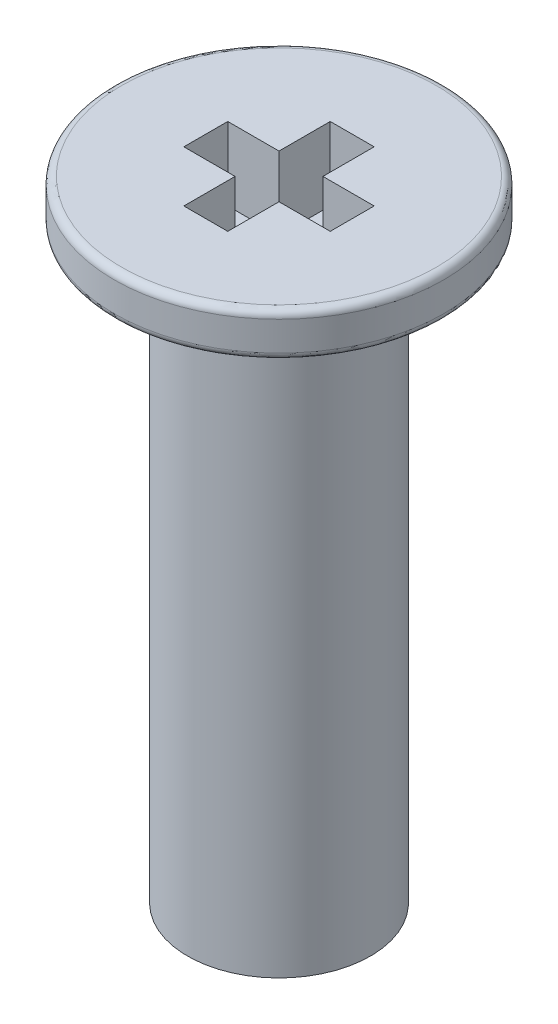
ISO-10303-21;
HEADER;
FILE_DESCRIPTION(('STEP AP214'),'2;1');
FILE_NAME('part.step','',(''),(''),'','','');
FILE_SCHEMA(('AUTOMOTIVE_DESIGN { 1 0 10303 214 1 1 1 1 }'));
ENDSEC;
DATA;
#1=APPLICATION_CONTEXT('core data for automotive mechanical design processes');
#2=APPLICATION_PROTOCOL_DEFINITION('international standard','automotive_design',2000,#1);
#3=PRODUCT_CONTEXT('',#1,'mechanical');
#4=PRODUCT('Part','Part','',(#3));
#5=PRODUCT_RELATED_PRODUCT_CATEGORY('part','',(#4));
#6=PRODUCT_DEFINITION_FORMATION('','',#4);
#7=PRODUCT_DEFINITION_CONTEXT('part definition',#1,'design');
#8=PRODUCT_DEFINITION('design','',#6,#7);
#9=PRODUCT_DEFINITION_SHAPE('','',#8);
#10=(LENGTH_UNIT() NAMED_UNIT(*) SI_UNIT(.MILLI.,.METRE.));
#11=(NAMED_UNIT(*) PLANE_ANGLE_UNIT() SI_UNIT($,.RADIAN.));
#12=(NAMED_UNIT(*) SI_UNIT($,.STERADIAN.) SOLID_ANGLE_UNIT());
#13=UNCERTAINTY_MEASURE_WITH_UNIT(LENGTH_MEASURE(1.E-05),#10,'distance_accuracy_value','');
#14=(GEOMETRIC_REPRESENTATION_CONTEXT(3) GLOBAL_UNCERTAINTY_ASSIGNED_CONTEXT((#13)) GLOBAL_UNIT_ASSIGNED_CONTEXT((#10,
#11,#12)) REPRESENTATION_CONTEXT('',''));
#15=CARTESIAN_POINT('',(0.,0.,0.));
#16=DIRECTION('',(0.,0.,1.));
#17=DIRECTION('',(1.,0.,0.));
#18=AXIS2_PLACEMENT_3D('',#15,#16,#17);
#19=CARTESIAN_POINT('',(0.,7.6,0.));
#20=DIRECTION('',(0.,1.,0.));
#21=DIRECTION('',(0.,0.,1.));
#22=AXIS2_PLACEMENT_3D('',#19,#20,#21);
#23=PLANE('',#22);
#24=DIRECTION('',(-1.,0.,0.));
#25=VECTOR('',#24,1.);
#26=CARTESIAN_POINT('',(0.3,7.6,-1.));
#27=LINE('',#26,#25);
#28=CARTESIAN_POINT('',(0.3,7.6,-1.));
#29=VERTEX_POINT('',#28);
#30=CARTESIAN_POINT('',(-0.3,7.6,-1.));
#31=VERTEX_POINT('',#30);
#32=EDGE_CURVE('E122',#29,#31,#27,.T.);
#33=ORIENTED_EDGE('',*,*,#32,.T.);
#34=DIRECTION('',(0.,0.,1.));
#35=VECTOR('',#34,1.);
#36=CARTESIAN_POINT('',(-0.3,7.6,-1.));
#37=LINE('',#36,#35);
#38=CARTESIAN_POINT('',(-0.3,7.6,-0.3));
#39=VERTEX_POINT('',#38);
#40=EDGE_CURVE('E119',#31,#39,#37,.T.);
#41=ORIENTED_EDGE('',*,*,#40,.T.);
#42=DIRECTION('',(-1.,0.,0.));
#43=VECTOR('',#42,1.);
#44=CARTESIAN_POINT('',(-0.3,7.6,-0.3));
#45=LINE('',#44,#43);
#46=CARTESIAN_POINT('',(-1.,7.6,-0.3));
#47=VERTEX_POINT('',#46);
#48=EDGE_CURVE('E116',#39,#47,#45,.T.);
#49=ORIENTED_EDGE('',*,*,#48,.T.);
#50=DIRECTION('',(0.,0.,1.));
#51=VECTOR('',#50,1.);
#52=CARTESIAN_POINT('',(-1.,7.6,-0.3));
#53=LINE('',#52,#51);
#54=CARTESIAN_POINT('',(-1.,7.6,0.3));
#55=VERTEX_POINT('',#54);
#56=EDGE_CURVE('E139',#47,#55,#53,.T.);
#57=ORIENTED_EDGE('',*,*,#56,.T.);
#58=DIRECTION('',(1.,0.,0.));
#59=VECTOR('',#58,1.);
#60=CARTESIAN_POINT('',(-1.,7.6,0.3));
#61=LINE('',#60,#59);
#62=CARTESIAN_POINT('',(-0.3,7.6,0.3));
#63=VERTEX_POINT('',#62);
#64=EDGE_CURVE('E249',#55,#63,#61,.T.);
#65=ORIENTED_EDGE('',*,*,#64,.T.);
#66=DIRECTION('',(0.,0.,1.));
#67=VECTOR('',#66,1.);
#68=CARTESIAN_POINT('',(-0.3,7.6,0.3));
#69=LINE('',#68,#67);
#70=CARTESIAN_POINT('',(-0.3,7.6,1.));
#71=VERTEX_POINT('',#70);
#72=EDGE_CURVE('E244',#63,#71,#69,.T.);
#73=ORIENTED_EDGE('',*,*,#72,.T.);
#74=DIRECTION('',(1.,0.,0.));
#75=VECTOR('',#74,1.);
#76=CARTESIAN_POINT('',(-0.3,7.6,1.));
#77=LINE('',#76,#75);
#78=CARTESIAN_POINT('',(0.3,7.6,1.));
#79=VERTEX_POINT('',#78);
#80=EDGE_CURVE('E239',#71,#79,#77,.T.);
#81=ORIENTED_EDGE('',*,*,#80,.T.);
#82=DIRECTION('',(0.,0.,-1.));
#83=VECTOR('',#82,1.);
#84=CARTESIAN_POINT('',(0.3,7.6,1.));
#85=LINE('',#84,#83);
#86=CARTESIAN_POINT('',(0.3,7.6,0.3));
#87=VERTEX_POINT('',#86);
#88=EDGE_CURVE('E234',#79,#87,#85,.T.);
#89=ORIENTED_EDGE('',*,*,#88,.T.);
#90=DIRECTION('',(1.,0.,0.));
#91=VECTOR('',#90,1.);
#92=CARTESIAN_POINT('',(0.3,7.6,0.3));
#93=LINE('',#92,#91);
#94=CARTESIAN_POINT('',(1.,7.6,0.3));
#95=VERTEX_POINT('',#94);
#96=EDGE_CURVE('E229',#87,#95,#93,.T.);
#97=ORIENTED_EDGE('',*,*,#96,.T.);
#98=DIRECTION('',(0.,0.,-1.));
#99=VECTOR('',#98,1.);
#100=CARTESIAN_POINT('',(1.,7.6,0.3));
#101=LINE('',#100,#99);
#102=CARTESIAN_POINT('',(1.,7.6,-0.3));
#103=VERTEX_POINT('',#102);
#104=EDGE_CURVE('E224',#95,#103,#101,.T.);
#105=ORIENTED_EDGE('',*,*,#104,.T.);
#106=DIRECTION('',(-1.,0.,0.));
#107=VECTOR('',#106,1.);
#108=CARTESIAN_POINT('',(1.,7.6,-0.3));
#109=LINE('',#108,#107);
#110=CARTESIAN_POINT('',(0.3,7.6,-0.3));
#111=VERTEX_POINT('',#110);
#112=EDGE_CURVE('E219',#103,#111,#109,.T.);
#113=ORIENTED_EDGE('',*,*,#112,.T.);
#114=DIRECTION('',(0.,0.,-1.));
#115=VECTOR('',#114,1.);
#116=CARTESIAN_POINT('',(0.3,7.6,-0.3));
#117=LINE('',#116,#115);
#118=EDGE_CURVE('E214',#111,#29,#117,.T.);
#119=ORIENTED_EDGE('',*,*,#118,.T.);
#120=EDGE_LOOP('',(#33,#41,#49,#57,#65,#73,#81,#89,#97,#105,#113,#119));
#121=FACE_BOUND('',#120,.T.);
#122=ADVANCED_FACE('F16',(#121),#23,.T.);
#123=CARTESIAN_POINT('',(-0.3,8.6,-1.));
#124=DIRECTION('',(-1.,0.,0.));
#125=DIRECTION('',(0.,0.,1.));
#126=AXIS2_PLACEMENT_3D('',#123,#124,#125);
#127=PLANE('',#126);
#128=ORIENTED_EDGE('',*,*,#40,.F.);
#129=DIRECTION('',(0.,1.,0.));
#130=VECTOR('',#129,1.);
#131=CARTESIAN_POINT('',(-0.3,8.6,-1.));
#132=LINE('',#131,#130);
#133=CARTESIAN_POINT('',(-0.3,8.6,-1.));
#134=VERTEX_POINT('',#133);
#135=EDGE_CURVE('E203',#31,#134,#132,.T.);
#136=ORIENTED_EDGE('',*,*,#135,.T.);
#137=DIRECTION('',(0.,0.,-1.));
#138=VECTOR('',#137,1.);
#139=CARTESIAN_POINT('',(-0.3,8.6,0.));
#140=LINE('',#139,#138);
#141=CARTESIAN_POINT('',(-0.3,8.6,-0.3));
#142=VERTEX_POINT('',#141);
#143=EDGE_CURVE('E130',#134,#142,#140,.F.);
#144=ORIENTED_EDGE('',*,*,#143,.T.);
#145=DIRECTION('',(0.,1.,0.));
#146=VECTOR('',#145,1.);
#147=CARTESIAN_POINT('',(-0.3,8.6,-0.3));
#148=LINE('',#147,#146);
#149=EDGE_CURVE('E125',#142,#39,#148,.F.);
#150=ORIENTED_EDGE('',*,*,#149,.T.);
#151=EDGE_LOOP('',(#128,#136,#144,#150));
#152=FACE_BOUND('',#151,.T.);
#153=ADVANCED_FACE('F128',(#152),#127,.F.);
#154=CARTESIAN_POINT('',(-0.3,8.6,-0.3));
#155=DIRECTION('',(0.,0.,-1.));
#156=DIRECTION('',(-1.,0.,0.));
#157=AXIS2_PLACEMENT_3D('',#154,#155,#156);
#158=PLANE('',#157);
#159=ORIENTED_EDGE('',*,*,#48,.F.);
#160=ORIENTED_EDGE('',*,*,#149,.F.);
#161=DIRECTION('',(1.,0.,0.));
#162=VECTOR('',#161,1.);
#163=CARTESIAN_POINT('',(0.,8.6,-0.3));
#164=LINE('',#163,#162);
#165=CARTESIAN_POINT('',(-1.,8.6,-0.3));
#166=VERTEX_POINT('',#165);
#167=EDGE_CURVE('E313',#142,#166,#164,.F.);
#168=ORIENTED_EDGE('',*,*,#167,.T.);
#169=DIRECTION('',(0.,1.,0.));
#170=VECTOR('',#169,1.);
#171=CARTESIAN_POINT('',(-1.,8.6,-0.3));
#172=LINE('',#171,#170);
#173=EDGE_CURVE('E136',#166,#47,#172,.F.);
#174=ORIENTED_EDGE('',*,*,#173,.T.);
#175=EDGE_LOOP('',(#159,#160,#168,#174));
#176=FACE_BOUND('',#175,.T.);
#177=ADVANCED_FACE('F134',(#176),#158,.F.);
#178=CARTESIAN_POINT('',(-1.,8.6,-0.3));
#179=DIRECTION('',(-1.,0.,0.));
#180=DIRECTION('',(0.,0.,1.));
#181=AXIS2_PLACEMENT_3D('',#178,#179,#180);
#182=PLANE('',#181);
#183=ORIENTED_EDGE('',*,*,#56,.F.);
#184=ORIENTED_EDGE('',*,*,#173,.F.);
#185=DIRECTION('',(0.,0.,-1.));
#186=VECTOR('',#185,1.);
#187=CARTESIAN_POINT('',(-1.,8.6,0.));
#188=LINE('',#187,#186);
#189=CARTESIAN_POINT('',(-1.,8.6,0.3));
#190=VERTEX_POINT('',#189);
#191=EDGE_CURVE('E258',#166,#190,#188,.F.);
#192=ORIENTED_EDGE('',*,*,#191,.T.);
#193=DIRECTION('',(0.,1.,0.));
#194=VECTOR('',#193,1.);
#195=CARTESIAN_POINT('',(-1.,8.6,0.3));
#196=LINE('',#195,#194);
#197=EDGE_CURVE('E251',#190,#55,#196,.F.);
#198=ORIENTED_EDGE('',*,*,#197,.T.);
#199=EDGE_LOOP('',(#183,#184,#192,#198));
#200=FACE_BOUND('',#199,.T.);
#201=ADVANCED_FACE('F256',(#200),#182,.F.);
#202=CARTESIAN_POINT('',(-1.,8.6,0.3));
#203=DIRECTION('',(0.,0.,1.));
#204=DIRECTION('',(1.,0.,0.));
#205=AXIS2_PLACEMENT_3D('',#202,#203,#204);
#206=PLANE('',#205);
#207=ORIENTED_EDGE('',*,*,#64,.F.);
#208=ORIENTED_EDGE('',*,*,#197,.F.);
#209=DIRECTION('',(1.,0.,0.));
#210=VECTOR('',#209,1.);
#211=CARTESIAN_POINT('',(0.,8.6,0.3));
#212=LINE('',#211,#210);
#213=CARTESIAN_POINT('',(-0.3,8.6,0.3));
#214=VERTEX_POINT('',#213);
#215=EDGE_CURVE('E264',#190,#214,#212,.T.);
#216=ORIENTED_EDGE('',*,*,#215,.T.);
#217=DIRECTION('',(0.,1.,0.));
#218=VECTOR('',#217,1.);
#219=CARTESIAN_POINT('',(-0.3,8.6,0.3));
#220=LINE('',#219,#218);
#221=EDGE_CURVE('E246',#214,#63,#220,.F.);
#222=ORIENTED_EDGE('',*,*,#221,.T.);
#223=EDGE_LOOP('',(#207,#208,#216,#222));
#224=FACE_BOUND('',#223,.T.);
#225=ADVANCED_FACE('F261',(#224),#206,.F.);
#226=CARTESIAN_POINT('',(-0.3,8.6,0.3));
#227=DIRECTION('',(-1.,0.,0.));
#228=DIRECTION('',(0.,0.,1.));
#229=AXIS2_PLACEMENT_3D('',#226,#227,#228);
#230=PLANE('',#229);
#231=ORIENTED_EDGE('',*,*,#72,.F.);
#232=ORIENTED_EDGE('',*,*,#221,.F.);
#233=DIRECTION('',(0.,0.,-1.));
#234=VECTOR('',#233,1.);
#235=CARTESIAN_POINT('',(-0.3,8.6,0.));
#236=LINE('',#235,#234);
#237=CARTESIAN_POINT('',(-0.3,8.6,1.));
#238=VERTEX_POINT('',#237);
#239=EDGE_CURVE('E318',#214,#238,#236,.F.);
#240=ORIENTED_EDGE('',*,*,#239,.T.);
#241=DIRECTION('',(0.,1.,0.));
#242=VECTOR('',#241,1.);
#243=CARTESIAN_POINT('',(-0.3,8.6,1.));
#244=LINE('',#243,#242);
#245=EDGE_CURVE('E241',#238,#71,#244,.F.);
#246=ORIENTED_EDGE('',*,*,#245,.T.);
#247=EDGE_LOOP('',(#231,#232,#240,#246));
#248=FACE_BOUND('',#247,.T.);
#249=ADVANCED_FACE('F267',(#248),#230,.F.);
#250=CARTESIAN_POINT('',(-0.3,8.6,1.));
#251=DIRECTION('',(0.,0.,1.));
#252=DIRECTION('',(1.,0.,0.));
#253=AXIS2_PLACEMENT_3D('',#250,#251,#252);
#254=PLANE('',#253);
#255=ORIENTED_EDGE('',*,*,#80,.F.);
#256=ORIENTED_EDGE('',*,*,#245,.F.);
#257=DIRECTION('',(1.,0.,0.));
#258=VECTOR('',#257,1.);
#259=CARTESIAN_POINT('',(0.,8.6,1.));
#260=LINE('',#259,#258);
#261=CARTESIAN_POINT('',(0.3,8.6,1.));
#262=VERTEX_POINT('',#261);
#263=EDGE_CURVE('E275',#238,#262,#260,.T.);
#264=ORIENTED_EDGE('',*,*,#263,.T.);
#265=DIRECTION('',(0.,1.,0.));
#266=VECTOR('',#265,1.);
#267=CARTESIAN_POINT('',(0.3,8.6,1.));
#268=LINE('',#267,#266);
#269=EDGE_CURVE('E236',#262,#79,#268,.F.);
#270=ORIENTED_EDGE('',*,*,#269,.T.);
#271=EDGE_LOOP('',(#255,#256,#264,#270));
#272=FACE_BOUND('',#271,.T.);
#273=ADVANCED_FACE('F273',(#272),#254,.F.);
#274=CARTESIAN_POINT('',(0.3,8.6,1.));
#275=DIRECTION('',(1.,0.,0.));
#276=DIRECTION('',(0.,0.,-1.));
#277=AXIS2_PLACEMENT_3D('',#274,#275,#276);
#278=PLANE('',#277);
#279=ORIENTED_EDGE('',*,*,#88,.F.);
#280=ORIENTED_EDGE('',*,*,#269,.F.);
#281=DIRECTION('',(0.,0.,-1.));
#282=VECTOR('',#281,1.);
#283=CARTESIAN_POINT('',(0.3,8.6,0.));
#284=LINE('',#283,#282);
#285=CARTESIAN_POINT('',(0.3,8.6,0.3));
#286=VERTEX_POINT('',#285);
#287=EDGE_CURVE('E281',#262,#286,#284,.T.);
#288=ORIENTED_EDGE('',*,*,#287,.T.);
#289=DIRECTION('',(0.,1.,0.));
#290=VECTOR('',#289,1.);
#291=CARTESIAN_POINT('',(0.3,8.6,0.3));
#292=LINE('',#291,#290);
#293=EDGE_CURVE('E231',#286,#87,#292,.F.);
#294=ORIENTED_EDGE('',*,*,#293,.T.);
#295=EDGE_LOOP('',(#279,#280,#288,#294));
#296=FACE_BOUND('',#295,.T.);
#297=ADVANCED_FACE('F278',(#296),#278,.F.);
#298=CARTESIAN_POINT('',(0.3,8.6,0.3));
#299=DIRECTION('',(0.,0.,1.));
#300=DIRECTION('',(1.,0.,0.));
#301=AXIS2_PLACEMENT_3D('',#298,#299,#300);
#302=PLANE('',#301);
#303=ORIENTED_EDGE('',*,*,#96,.F.);
#304=ORIENTED_EDGE('',*,*,#293,.F.);
#305=DIRECTION('',(1.,0.,0.));
#306=VECTOR('',#305,1.);
#307=CARTESIAN_POINT('',(0.,8.6,0.3));
#308=LINE('',#307,#306);
#309=CARTESIAN_POINT('',(1.,8.6,0.3));
#310=VERTEX_POINT('',#309);
#311=EDGE_CURVE('E322',#286,#310,#308,.T.);
#312=ORIENTED_EDGE('',*,*,#311,.T.);
#313=DIRECTION('',(0.,1.,0.));
#314=VECTOR('',#313,1.);
#315=CARTESIAN_POINT('',(1.,8.6,0.3));
#316=LINE('',#315,#314);
#317=EDGE_CURVE('E226',#310,#95,#316,.F.);
#318=ORIENTED_EDGE('',*,*,#317,.T.);
#319=EDGE_LOOP('',(#303,#304,#312,#318));
#320=FACE_BOUND('',#319,.T.);
#321=ADVANCED_FACE('F284',(#320),#302,.F.);
#322=CARTESIAN_POINT('',(1.,8.6,0.3));
#323=DIRECTION('',(1.,0.,0.));
#324=DIRECTION('',(0.,0.,-1.));
#325=AXIS2_PLACEMENT_3D('',#322,#323,#324);
#326=PLANE('',#325);
#327=ORIENTED_EDGE('',*,*,#104,.F.);
#328=ORIENTED_EDGE('',*,*,#317,.F.);
#329=DIRECTION('',(0.,0.,-1.));
#330=VECTOR('',#329,1.);
#331=CARTESIAN_POINT('',(1.,8.6,0.));
#332=LINE('',#331,#330);
#333=CARTESIAN_POINT('',(1.,8.6,-0.3));
#334=VERTEX_POINT('',#333);
#335=EDGE_CURVE('E292',#310,#334,#332,.T.);
#336=ORIENTED_EDGE('',*,*,#335,.T.);
#337=DIRECTION('',(0.,1.,0.));
#338=VECTOR('',#337,1.);
#339=CARTESIAN_POINT('',(1.,8.6,-0.3));
#340=LINE('',#339,#338);
#341=EDGE_CURVE('E221',#334,#103,#340,.F.);
#342=ORIENTED_EDGE('',*,*,#341,.T.);
#343=EDGE_LOOP('',(#327,#328,#336,#342));
#344=FACE_BOUND('',#343,.T.);
#345=ADVANCED_FACE('F290',(#344),#326,.F.);
#346=CARTESIAN_POINT('',(1.,8.6,-0.3));
#347=DIRECTION('',(0.,0.,-1.));
#348=DIRECTION('',(-1.,0.,0.));
#349=AXIS2_PLACEMENT_3D('',#346,#347,#348);
#350=PLANE('',#349);
#351=ORIENTED_EDGE('',*,*,#112,.F.);
#352=ORIENTED_EDGE('',*,*,#341,.F.);
#353=DIRECTION('',(1.,0.,0.));
#354=VECTOR('',#353,1.);
#355=CARTESIAN_POINT('',(0.,8.6,-0.3));
#356=LINE('',#355,#354);
#357=CARTESIAN_POINT('',(0.3,8.6,-0.3));
#358=VERTEX_POINT('',#357);
#359=EDGE_CURVE('E298',#334,#358,#356,.F.);
#360=ORIENTED_EDGE('',*,*,#359,.T.);
#361=DIRECTION('',(0.,1.,0.));
#362=VECTOR('',#361,1.);
#363=CARTESIAN_POINT('',(0.3,8.6,-0.3));
#364=LINE('',#363,#362);
#365=EDGE_CURVE('E216',#358,#111,#364,.F.);
#366=ORIENTED_EDGE('',*,*,#365,.T.);
#367=EDGE_LOOP('',(#351,#352,#360,#366));
#368=FACE_BOUND('',#367,.T.);
#369=ADVANCED_FACE('F295',(#368),#350,.F.);
#370=CARTESIAN_POINT('',(0.3,8.6,-0.3));
#371=DIRECTION('',(1.,0.,0.));
#372=DIRECTION('',(0.,0.,-1.));
#373=AXIS2_PLACEMENT_3D('',#370,#371,#372);
#374=PLANE('',#373);
#375=ORIENTED_EDGE('',*,*,#118,.F.);
#376=ORIENTED_EDGE('',*,*,#365,.F.);
#377=DIRECTION('',(0.,0.,-1.));
#378=VECTOR('',#377,1.);
#379=CARTESIAN_POINT('',(0.3,8.6,0.));
#380=LINE('',#379,#378);
#381=CARTESIAN_POINT('',(0.3,8.6,-1.));
#382=VERTEX_POINT('',#381);
#383=EDGE_CURVE('E303',#358,#382,#380,.T.);
#384=ORIENTED_EDGE('',*,*,#383,.T.);
#385=DIRECTION('',(0.,1.,0.));
#386=VECTOR('',#385,1.);
#387=CARTESIAN_POINT('',(0.3,8.6,-1.));
#388=LINE('',#387,#386);
#389=EDGE_CURVE('E211',#382,#29,#388,.F.);
#390=ORIENTED_EDGE('',*,*,#389,.T.);
#391=EDGE_LOOP('',(#375,#376,#384,#390));
#392=FACE_BOUND('',#391,.T.);
#393=ADVANCED_FACE('F301',(#392),#374,.F.);
#394=CARTESIAN_POINT('',(0.3,8.6,-1.));
#395=DIRECTION('',(0.,0.,-1.));
#396=DIRECTION('',(-1.,0.,0.));
#397=AXIS2_PLACEMENT_3D('',#394,#395,#396);
#398=PLANE('',#397);
#399=ORIENTED_EDGE('',*,*,#32,.F.);
#400=ORIENTED_EDGE('',*,*,#389,.F.);
#401=DIRECTION('',(1.,0.,0.));
#402=VECTOR('',#401,1.);
#403=CARTESIAN_POINT('',(0.,8.6,-1.));
#404=LINE('',#403,#402);
#405=EDGE_CURVE('E308',#382,#134,#404,.F.);
#406=ORIENTED_EDGE('',*,*,#405,.T.);
#407=ORIENTED_EDGE('',*,*,#135,.F.);
#408=EDGE_LOOP('',(#399,#400,#406,#407));
#409=FACE_BOUND('',#408,.T.);
#410=ADVANCED_FACE('F307',(#409),#398,.F.);
#411=CARTESIAN_POINT('',(0.,8.6,0.));
#412=DIRECTION('',(0.,-1.,0.));
#413=DIRECTION('',(0.,0.,-1.));
#414=AXIS2_PLACEMENT_3D('',#411,#412,#413);
#415=PLANE('',#414);
#416=ORIENTED_EDGE('',*,*,#383,.F.);
#417=ORIENTED_EDGE('',*,*,#359,.F.);
#418=ORIENTED_EDGE('',*,*,#335,.F.);
#419=ORIENTED_EDGE('',*,*,#311,.F.);
#420=ORIENTED_EDGE('',*,*,#287,.F.);
#421=ORIENTED_EDGE('',*,*,#263,.F.);
#422=ORIENTED_EDGE('',*,*,#239,.F.);
#423=ORIENTED_EDGE('',*,*,#215,.F.);
#424=ORIENTED_EDGE('',*,*,#191,.F.);
#425=ORIENTED_EDGE('',*,*,#167,.F.);
#426=ORIENTED_EDGE('',*,*,#143,.F.);
#427=ORIENTED_EDGE('',*,*,#405,.F.);
#428=EDGE_LOOP('',(#416,#417,#418,#419,#420,#421,#422,#423,#424,#425,#426,#427));
#429=FACE_BOUND('',#428,.T.);
#430=CARTESIAN_POINT('',(0.,8.6,0.));
#431=DIRECTION('',(0.,-1.,0.));
#432=DIRECTION('',(-1.,0.,0.));
#433=AXIS2_PLACEMENT_3D('',#430,#431,#432);
#434=CIRCLE('',#433,2.1499999932975);
#435=CARTESIAN_POINT('',(-2.149999989276,8.6,0.));
#436=VERTEX_POINT('',#435);
#437=CARTESIAN_POINT('',(2.149999989276,8.6,0.));
#438=VERTEX_POINT('',#437);
#439=EDGE_CURVE('E344',#436,#438,#434,.T.);
#440=ORIENTED_EDGE('',*,*,#439,.F.);
#441=CARTESIAN_POINT('',(2.149999986595,8.6,0.));
#442=CARTESIAN_POINT('',(2.15000080069782,8.60000000006606,0.00774593605143662));
#443=CARTESIAN_POINT('',(2.14996033296819,8.60000000003913,0.0154920532896195));
#444=CARTESIAN_POINT('',(2.14962310452812,8.59999999954828,0.0473801378276606));
#445=CARTESIAN_POINT('',(2.14896515022345,8.59999999828005,0.0715193011728395));
#446=CARTESIAN_POINT('',(2.14683394931852,8.59999999399274,0.11976118063808));
#447=CARTESIAN_POINT('',(2.14536069389768,8.59999999097364,0.143863896360994));
#448=CARTESIAN_POINT('',(2.14129184385814,8.59999998285581,0.195997430603873));
#449=CARTESIAN_POINT('',(2.13855067588309,8.59999997749528,0.224017025537864));
#450=CARTESIAN_POINT('',(2.13196958666373,8.59999996513263,0.279926932795387));
#451=CARTESIAN_POINT('',(2.12812965291208,8.5999999581305,0.307817243643594));
#452=CARTESIAN_POINT('',(2.11935718603045,8.59999994282781,0.363425880042789));
#453=CARTESIAN_POINT('',(2.11442464118614,8.59999993452725,0.391144203746554));
#454=CARTESIAN_POINT('',(2.10347447928715,8.59999991694442,0.446365957623545));
#455=CARTESIAN_POINT('',(2.09745685131675,8.59999990766214,0.473869385632056));
#456=CARTESIAN_POINT('',(2.08434581218323,8.59999988841404,0.528618897159319));
#457=CARTESIAN_POINT('',(2.07725239090954,8.59999987844819,0.555864978256907));
#458=CARTESIAN_POINT('',(2.06200069447204,8.5999998581104,0.610057708135593));
#459=CARTESIAN_POINT('',(2.05384241000484,8.59999984773845,0.637004354298386));
#460=CARTESIAN_POINT('',(2.03647356862558,8.59999982684575,0.690556597552216));
#461=CARTESIAN_POINT('',(2.02726300321614,8.59999981632501,0.717162191887262));
#462=CARTESIAN_POINT('',(2.00780380640816,8.59999979537179,0.769991238714149));
#463=CARTESIAN_POINT('',(1.99755516731364,8.59999978493931,0.796214688371225));
#464=CARTESIAN_POINT('',(1.97603563471533,8.59999976437943,0.848238943706191));
#465=CARTESIAN_POINT('',(1.96476473430895,8.59999975425204,0.874039746528859));
#466=CARTESIAN_POINT('',(1.94121807080314,8.59999973449889,0.925178858534139));
#467=CARTESIAN_POINT('',(1.92894230158318,8.59999972487315,0.950517164898597));
#468=CARTESIAN_POINT('',(1.9034048455692,8.59999970629963,1.00069214867668));
#469=CARTESIAN_POINT('',(1.89014315342213,8.59999969735185,1.02552882336578));
#470=CARTESIAN_POINT('',(1.86265432074884,8.59999968029037,1.07466218332238));
#471=CARTESIAN_POINT('',(1.84842717561924,8.59999967217666,1.09895886601442));
#472=CARTESIAN_POINT('',(1.81902939861524,8.59999965691913,1.1469747157121));
#473=CARTESIAN_POINT('',(1.80385876286618,8.59999964977532,1.17069388034549));
#474=CARTESIAN_POINT('',(1.77259742473602,8.59999963657318,1.21751805992205));
#475=CARTESIAN_POINT('',(1.75650671918496,8.59999963051486,1.24062307274885));
#476=CARTESIAN_POINT('',(1.7234300838262,8.59999961957906,1.28618326364882));
#477=CARTESIAN_POINT('',(1.70644415152619,8.59999961470158,1.30863843991257));
#478=CARTESIAN_POINT('',(1.67160328888854,8.59999960620256,1.35286427677269));
#479=CARTESIAN_POINT('',(1.65374835670632,8.59999960258103,1.37463493591592));
#480=CARTESIAN_POINT('',(1.61719706380519,8.59999959664878,1.41745811542631));
#481=CARTESIAN_POINT('',(1.59850070185671,8.59999959433806,1.43851063474399));
#482=CARTESIAN_POINT('',(1.56029541956434,8.59999959106205,1.47986502131745));
#483=CARTESIAN_POINT('',(1.54078649857048,8.59999959009676,1.50016688797275));
#484=CARTESIAN_POINT('',(1.5009862243135,8.59999958952599,1.53998861605828));
#485=CARTESIAN_POINT('',(1.48069487094199,8.59999958992051,1.55950847738018));
#486=CARTESIAN_POINT('',(1.43936106744049,8.59999959206348,1.59773605026213));
#487=CARTESIAN_POINT('',(1.41831861770323,8.59999959381193,1.61644376224683));
#488=CARTESIAN_POINT('',(1.37551511789299,8.59999959863666,1.65301814717662));
#489=CARTESIAN_POINT('',(1.35375406867106,8.59999960171293,1.67088482111771));
#490=CARTESIAN_POINT('',(1.30954697695609,8.59999960914696,1.70574954063073));
#491=CARTESIAN_POINT('',(1.28710093572741,8.5999996135047,1.7227475878058));
#492=CARTESIAN_POINT('',(1.2415585257159,8.59999962343505,1.7558488070819));
#493=CARTESIAN_POINT('',(1.21846215856364,8.59999962900766,1.77195198142634));
#494=CARTESIAN_POINT('',(1.17165476744577,8.5999996412809,1.80323859155864));
#495=CARTESIAN_POINT('',(1.14794374542793,8.59999964798153,1.81842203026052));
#496=CARTESIAN_POINT('',(1.09994366515913,8.59999966240373,1.84784572730363));
#497=CARTESIAN_POINT('',(1.07565460912235,8.59999967012529,1.86208598925693));
#498=CARTESIAN_POINT('',(1.02653597458109,8.59999968646203,1.88960134893141));
#499=CARTESIAN_POINT('',(1.00170639850478,8.59999969507719,1.90287645098717));
#500=CARTESIAN_POINT('',(0.951545072796554,8.59999971305355,1.92844099892718));
#501=CARTESIAN_POINT('',(0.926213325752882,8.59999972241473,1.94073044988992));
#502=CARTESIAN_POINT('',(0.875086782844244,8.59999974171532,1.96430472731528));
#503=CARTESIAN_POINT('',(0.849291989672395,8.59999975165471,1.97558955961857));
#504=CARTESIAN_POINT('',(0.797279194513991,8.59999977192365,1.99713718436665));
#505=CARTESIAN_POINT('',(0.771061195269073,8.59999978225318,2.00739998342935));
#506=CARTESIAN_POINT('',(0.718242481679461,8.59999980309408,2.02688770611376));
#507=CARTESIAN_POINT('',(0.691641770067589,8.59999981360544,2.0361126371424));
#508=CARTESIAN_POINT('',(0.638098716245726,8.59999983458146,2.05351039286826));
#509=CARTESIAN_POINT('',(0.611156376701597,8.59999984504611,2.06168322576987));
#510=CARTESIAN_POINT('',(0.556971679760432,8.59999986567986,2.07696417939713));
#511=CARTESIAN_POINT('',(0.529729324903508,8.59999987584896,2.08407230912977));
#512=CARTESIAN_POINT('',(0.474986670142488,8.59999989562273,2.09721290121152));
#513=CARTESIAN_POINT('',(0.447486372593535,8.5999999052274,2.10324537337187));
#514=CARTESIAN_POINT('',(0.392270314419468,8.59999992358243,2.11422533983751));
#515=CARTESIAN_POINT('',(0.364554555904893,8.59999993233279,2.11917284475674));
#516=CARTESIAN_POINT('',(0.308950348235704,8.59999994867188,2.12797531054694));
#517=CARTESIAN_POINT('',(0.281061900887815,8.59999995626062,2.13183028282868));
#518=CARTESIAN_POINT('',(0.225155509992018,8.59999996993841,2.13844155525239));
#519=CARTESIAN_POINT('',(0.19713756788577,8.59999997602748,2.14119786759602));
#520=CARTESIAN_POINT('',(0.139019984303278,8.59999998675506,2.14576510641112));
#521=CARTESIAN_POINT('',(0.108913937754954,8.59999999125969,2.14749490529091));
#522=CARTESIAN_POINT('',(0.0486559356796474,8.59999999759841,2.14968392118278));
#523=CARTESIAN_POINT('',(0.0185039807715552,8.59999999943254,2.15014315517419));
#524=CARTESIAN_POINT('',(-0.0367327257122932,8.60000000033861,2.14983009518945));
#525=CARTESIAN_POINT('',(-0.0618187933418984,8.5999999998224,2.14925151610049));
#526=CARTESIAN_POINT('',(-0.111950954808416,8.60000000013151,2.14723159840049));
#527=CARTESIAN_POINT('',(-0.136997056011809,8.60000000095655,2.14579044329457));
#528=CARTESIAN_POINT('',(-0.188934034654331,8.5999999893,2.14190230316815));
#529=CARTESIAN_POINT('',(-0.215819810990998,8.59999997579798,2.13938694465135));
#530=CARTESIAN_POINT('',(-0.269474540545667,8.59999990568424,2.13335947083679));
#531=CARTESIAN_POINT('',(-0.296243514808059,8.59999984908063,2.12984754331643));
#532=CARTESIAN_POINT('',(-0.341551986341568,8.59999964849556,2.12305072381684));
#533=CARTESIAN_POINT('',(-0.360129841535029,8.59999953614883,2.12001888138943));
#534=CARTESIAN_POINT('',(-0.395988099159118,8.59999928648878,2.1136780147832));
#535=CARTESIAN_POINT('',(-0.413273970144807,8.59999915128614,2.11040004095345));
#536=CARTESIAN_POINT('',(-0.447750179463647,8.59999894463088,2.10340388361942));
#537=CARTESIAN_POINT('',(-0.464940547681312,8.59999887315706,2.09968584701029));
#538=CARTESIAN_POINT('',(-0.508386298558855,8.59999878572617,2.08971115451948));
#539=CARTESIAN_POINT('',(-0.534574652583917,8.59999881987861,2.08315999208146));
#540=CARTESIAN_POINT('',(-0.586659017485568,8.5999990497247,2.06904120299429));
#541=CARTESIAN_POINT('',(-0.612555192380977,8.59999924532262,2.06147418089643));
#542=CARTESIAN_POINT('',(-0.654408942488655,8.59999957782712,2.04836685705507));
#543=CARTESIAN_POINT('',(-0.670461131331646,8.59999970932324,2.04312707189765));
#544=CARTESIAN_POINT('',(-0.702416444216825,8.59999991169169,2.03223251512861));
#545=CARTESIAN_POINT('',(-0.718319628225929,8.59999998258955,2.02657791932746));
#546=CARTESIAN_POINT('',(-0.74172684769567,8.60000000670886,2.01801787039137));
#547=CARTESIAN_POINT('',(-0.749271568504442,8.60000000209347,2.01522211386584));
#548=CARTESIAN_POINT('',(-0.778008200830705,8.59999999188275,2.0044058735253));
#549=CARTESIAN_POINT('',(-0.799100193739778,8.59999999973082,1.99611793752223));
#550=CARTESIAN_POINT('',(-0.853605230322323,8.59999998547424,1.97370161504216));
#551=CARTESIAN_POINT('',(-0.886807873296071,8.59999994254266,1.9590557492538));
#552=CARTESIAN_POINT('',(-0.933340836602631,8.59999982199671,1.93711651684663));
#553=CARTESIAN_POINT('',(-0.946995726462715,8.59999977908529,1.93050210824914));
#554=CARTESIAN_POINT('',(-0.975527727764956,8.59999966791427,1.91630837584245));
#555=CARTESIAN_POINT('',(-0.990389871635316,8.59999959754188,1.90869885724546));
#556=CARTESIAN_POINT('',(-1.02336933440679,8.59999942778698,1.89132210664677));
#557=CARTESIAN_POINT('',(-1.04143930348594,8.59999932546446,1.88146484536622));
#558=CARTESIAN_POINT('',(-1.07677089700574,8.59999914942806,1.86151572131735));
#559=CARTESIAN_POINT('',(-1.09404086584091,8.59999907498031,1.8514386088025));
#560=CARTESIAN_POINT('',(-1.1369790810182,8.59999893225028,1.82556179902836));
#561=CARTESIAN_POINT('',(-1.162462074814,8.59999888626602,1.80945301230116));
#562=CARTESIAN_POINT('',(-1.2115053106527,8.59999893721081,1.77695273050121));
#563=CARTESIAN_POINT('',(-1.23509916169675,8.59999902739387,1.76061181596461));
#564=CARTESIAN_POINT('',(-1.28657647332024,8.59999924674374,1.72339957685618));
#565=CARTESIAN_POINT('',(-1.31429976274231,8.59999938012287,1.70230609471656));
#566=CARTESIAN_POINT('',(-1.36698701757496,8.59999956741272,1.6601760384637));
#567=CARTESIAN_POINT('',(-1.3920148894351,8.59999962579173,1.63921923338516));
#568=CARTESIAN_POINT('',(-1.44043198069626,8.59999971565015,1.59677516773357));
#569=CARTESIAN_POINT('',(-1.46384721319268,8.59999974781452,1.57531759306845));
#570=CARTESIAN_POINT('',(-1.50798695252182,8.59999978604229,1.5330454864328));
#571=CARTESIAN_POINT('',(-1.52878139623543,8.59999979388637,1.51230391500476));
#572=CARTESIAN_POINT('',(-1.56785578122464,8.59999978765169,1.47171394645494));
#573=CARTESIAN_POINT('',(-1.58620271451367,8.59999977530323,1.45193000732491));
#574=CARTESIAN_POINT('',(-1.62055707330077,8.59999972698387,1.41347304403005));
#575=CARTESIAN_POINT('',(-1.63662787084996,8.59999969319961,1.39485659506107));
#576=CARTESIAN_POINT('',(-1.66549783522417,8.59999957522983,1.36025423494378));
#577=CARTESIAN_POINT('',(-1.67839440919856,8.59999950042574,1.34434951208863));
#578=CARTESIAN_POINT('',(-1.70044323676818,8.59999934222985,1.31635276608809));
#579=CARTESIAN_POINT('',(-1.70969887352107,8.59999926610082,1.30434208837876));
#580=CARTESIAN_POINT('',(-1.72804935744845,8.59999913736928,1.27998766953334));
#581=CARTESIAN_POINT('',(-1.73714125375118,8.59999908503907,1.26764170663138));
#582=CARTESIAN_POINT('',(-1.76291470311517,8.59999896787105,1.23183421047757));
#583=CARTESIAN_POINT('',(-1.77925494639789,8.59999893235638,1.20812575824767));
#584=CARTESIAN_POINT('',(-1.81127075638015,8.59999895917725,1.15957866498022));
#585=CARTESIAN_POINT('',(-1.8269264137164,8.59999902349,1.13472689264331));
#586=CARTESIAN_POINT('',(-1.85119125149652,8.59999917962963,1.0943711236435));
#587=CARTESIAN_POINT('',(-1.86013372984039,8.59999925044564,1.07906651937784));
#588=CARTESIAN_POINT('',(-1.87773098584277,8.59999940881095,1.0480596894104));
#589=CARTESIAN_POINT('',(-1.88638128196694,8.59999949654302,1.03235491599591));
#590=CARTESIAN_POINT('',(-1.90156868506059,8.5999996383761,1.00394265290586));
#591=CARTESIAN_POINT('',(-1.90817831609692,8.59999969568888,0.991273852247844));
#592=CARTESIAN_POINT('',(-1.92089355066472,8.59999978740271,0.966306198780744));
#593=CARTESIAN_POINT('',(-1.92700875726369,8.59999982261131,0.954012226457803));
#594=CARTESIAN_POINT('',(-1.946749368174,8.59999991756306,0.913362952353609));
#595=CARTESIAN_POINT('',(-1.95987759731027,8.5999999502929,0.884764009318759));
#596=CARTESIAN_POINT('',(-1.983537286361,8.59999998410806,0.830136412406705));
#597=CARTESIAN_POINT('',(-1.99419613557442,8.59999998822234,0.804162737367854));
#598=CARTESIAN_POINT('',(-2.01098754684831,8.59999998943863,0.760896607542012));
#599=CARTESIAN_POINT('',(-2.01740843444582,8.59999998847686,0.74371556964312));
#600=CARTESIAN_POINT('',(-2.02921279224795,8.59999997528239,0.710896274141912));
#601=CARTESIAN_POINT('',(-2.03463619478914,8.59999996416698,0.695272391646315));
#602=CARTESIAN_POINT('',(-2.04451195201436,8.59999992517893,0.665743358969353));
#603=CARTESIAN_POINT('',(-2.0490036271017,8.59999989942236,0.65185132492131));
#604=CARTESIAN_POINT('',(-2.06138864215871,8.59999982276813,0.612150522549851));
#605=CARTESIAN_POINT('',(-2.06893438666898,8.59999976908225,0.586232328223936));
#606=CARTESIAN_POINT('',(-2.08303688626013,8.59999966973961,0.534128913773672));
#607=CARTESIAN_POINT('',(-2.0895936365906,8.5999996240829,0.507943692367362));
#608=CARTESIAN_POINT('',(-2.10170736827423,8.59999955600958,0.455343005476759));
#609=CARTESIAN_POINT('',(-2.1072643576175,8.59999953359279,0.428927541834333));
#610=CARTESIAN_POINT('',(-2.11737084966501,8.59999951761519,0.375905212903549));
#611=CARTESIAN_POINT('',(-2.1219203733095,8.59999952405378,0.349298351605276));
#612=CARTESIAN_POINT('',(-2.13000527913739,8.5999995642371,0.29593188832051));
#613=CARTESIAN_POINT('',(-2.13354069537192,8.5999995979809,0.269172291493263));
#614=CARTESIAN_POINT('',(-2.13959237603141,8.59999968323293,0.215539364798813));
#615=CARTESIAN_POINT('',(-2.14210868771286,8.59999973474032,0.188666040263634));
#616=CARTESIAN_POINT('',(-2.14611852387307,8.59999983885926,0.134844791825101));
#617=CARTESIAN_POINT('',(-2.14761210886248,8.59999989147074,0.107896872429965));
#618=CARTESIAN_POINT('',(-2.14957477184175,8.59999997135012,0.0539656963027015));
#619=CARTESIAN_POINT('',(-2.15004392355506,8.59999999861985,0.0269824422532858));
#620=CARTESIAN_POINT('',(-2.149999986595,8.6,0.));
#621=B_SPLINE_CURVE_WITH_KNOTS('',3,(#441,#442,#443,#444,#445,#446,#447,#448,#449,#450,#451,
#452,#453,#454,#455,#456,#457,#458,#459,#460,#461,#462,#463,#464,#465,#466,#467,#468,#469,#470,
#471,#472,#473,#474,#475,#476,#477,#478,#479,#480,#481,#482,#483,#484,#485,#486,#487,#488,#489,
#490,#491,#492,#493,#494,#495,#496,#497,#498,#499,#500,#501,#502,#503,#504,#505,#506,#507,#508,
#509,#510,#511,#512,#513,#514,#515,#516,#517,#518,#519,#520,#521,#522,#523,#524,#525,#526,#527,
#528,#529,#530,#531,#532,#533,#534,#535,#536,#537,#538,#539,#540,#541,#542,#543,#544,#545,#546,
#547,#548,#549,#550,#551,#552,#553,#554,#555,#556,#557,#558,#559,#560,#561,#562,#563,#564,#565,
#566,#567,#568,#569,#570,#571,#572,#573,#574,#575,#576,#577,#578,#579,#580,#581,#582,#583,#584,
#585,#586,#587,#588,#589,#590,#591,#592,#593,#594,#595,#596,#597,#598,#599,#600,#601,#602,#603,
#604,#605,#606,#607,#608,#609,#610,#611,#612,#613,#614,#615,#616,#617,#618,#619,#620),
.UNSPECIFIED.,.F.,.F.,(4,2,2,2,2,2,2,2,2,2,2,2,2,2,2,2,2,2,2,2,2,2,2,2,2,2,2,2,2,2,2,2,2,2,2,2,
2,2,2,2,2,2,2,2,2,2,2,2,2,2,2,2,2,2,2,2,2,2,2,2,2,2,2,2,2,2,2,2,2,2,2,2,2,2,2,2,2,2,2,2,2,2,2,2,
2,2,2,2,2,4),(0.,0.0232381667629107,0.0956674660123254,0.168097548875066,0.252535257162046,
0.336973926648504,0.421413501481237,0.505853925807047,0.590295143772732,0.674737099525102,
0.759179737210993,0.843623000977272,0.928066834970835,1.01251118333863,1.09695599022763,
1.18140119978486,1.26584675615737,1.35029260349226,1.43473868593664,1.51918494763766,
1.6036313327425,1.68807778539834,1.77252424975236,1.85697066995176,1.94141699014374,
2.02586315447546,2.11030910709408,2.19475479214674,2.27920015378054,2.36364513614256,
2.44808968337983,2.53253373963935,2.61697724906807,2.70142015581292,2.78586240402078,
2.87030393783849,2.95474470141288,3.03918463889076,3.12362369441891,3.20806181214415,
3.29850202263706,3.38894102451671,3.46420477552116,3.53945252054305,3.62044345253703,
3.70141913402603,3.75788412448158,3.81066007808848,3.86341846424151,3.94438276892722,
4.02529910254422,4.07595127508576,4.12658210223249,4.15072018057652,4.21869619248144,
4.3275096279731,4.37302501234876,4.42311119368402,4.48485317503028,4.54483105256976,
4.63524369529969,4.72132167973816,4.82578537516969,4.92368256651209,5.0189314658792,
5.10701860972928,5.18794506090873,5.2617116062304,5.32313258041657,5.36861878132939,
5.41461306763089,5.50096963027292,5.58905854338842,5.64223055863787,5.69601300994168,
5.73887826658625,5.78006906329852,5.87444086876867,5.95864695027103,6.01366657421598,
6.06327741143164,6.10707527785788,6.18803684309661,6.26899879720394,6.34996010423347,
6.43091972831766,6.51187663366659,6.59282978456639,6.6737781453785,6.7547206805411),.UNSPECIFIED.);
#622=EDGE_CURVE('E310',#438,#436,#621,.T.);
#623=ORIENTED_EDGE('',*,*,#622,.F.);
#624=EDGE_LOOP('',(#440,#623));
#625=FACE_BOUND('',#624,.T.);
#626=ADVANCED_FACE('F191',(#429,#625),#415,.F.);
#627=CARTESIAN_POINT('',(0.,8.5,0.));
#628=DIRECTION('',(0.,-1.,0.));
#629=DIRECTION('',(0.999941588818126,0.,0.0108082816341003));
#630=AXIS2_PLACEMENT_3D('',#627,#628,#629);
#631=TOROIDAL_SURFACE('',#630,2.15,0.1);
#632=CARTESIAN_POINT('',(0.,8.5,0.));
#633=DIRECTION('',(0.,-1.,0.));
#634=DIRECTION('',(0.,0.,-1.));
#635=AXIS2_PLACEMENT_3D('',#632,#633,#634);
#636=CIRCLE('',#635,2.25);
#637=CARTESIAN_POINT('',(0.,8.5,-2.25));
#638=VERTEX_POINT('',#637);
#639=EDGE_CURVE('E183',#638,#638,#636,.T.);
#640=ORIENTED_EDGE('',*,*,#639,.F.);
#641=EDGE_LOOP('',(#640));
#642=FACE_BOUND('',#641,.T.);
#643=ORIENTED_EDGE('',*,*,#439,.T.);
#644=ORIENTED_EDGE('',*,*,#622,.T.);
#645=EDGE_LOOP('',(#643,#644));
#646=FACE_BOUND('',#645,.T.);
#647=ADVANCED_FACE('F187',(#642,#646),#631,.T.);
#648=CARTESIAN_POINT('',(0.,9.03,0.));
#649=DIRECTION('',(0.,-1.,0.));
#650=DIRECTION('',(0.,0.,-1.));
#651=AXIS2_PLACEMENT_3D('',#648,#649,#650);
#652=CYLINDRICAL_SURFACE('',#651,2.25);
#653=CARTESIAN_POINT('',(0.,8.1,0.));
#654=DIRECTION('',(0.,-1.,0.));
#655=DIRECTION('',(0.999973238881469,0.,0.00731584040999477));
#656=AXIS2_PLACEMENT_3D('',#653,#654,#655);
#657=CIRCLE('',#656,2.25);
#658=CARTESIAN_POINT('',(2.24993978748331,8.1,0.0164606409224882));
#659=VERTEX_POINT('',#658);
#660=EDGE_CURVE('E175',#659,#659,#657,.T.);
#661=ORIENTED_EDGE('',*,*,#660,.F.);
#662=EDGE_LOOP('',(#661));
#663=FACE_BOUND('',#662,.T.);
#664=ORIENTED_EDGE('',*,*,#639,.T.);
#665=EDGE_LOOP('',(#664));
#666=FACE_BOUND('',#665,.T.);
#667=ADVANCED_FACE('F162',(#663,#666),#652,.T.);
#668=CARTESIAN_POINT('',(0.,8.1,0.));
#669=DIRECTION('',(0.,-1.,0.));
#670=DIRECTION('',(0.999973238881469,0.,0.00731584040999477));
#671=AXIS2_PLACEMENT_3D('',#668,#669,#670);
#672=TOROIDAL_SURFACE('',#671,2.15,0.1);
#673=CARTESIAN_POINT('',(-2.149999991969,8.,0.));
#674=CARTESIAN_POINT('',(-2.1500004579614,8.,0.0312705020305879));
#675=CARTESIAN_POINT('',(-2.14931779249364,8.,0.0625409688214446));
#676=CARTESIAN_POINT('',(-2.14658954426164,8.,0.125022396148887));
#677=CARTESIAN_POINT('',(-2.14454396149739,8.,0.156233356685472));
#678=CARTESIAN_POINT('',(-2.13909322429624,8.,0.218536335729563));
#679=CARTESIAN_POINT('',(-2.13568806985933,8.,0.24962835423707));
#680=CARTESIAN_POINT('',(-2.12752481812347,8.,0.31163427021264));
#681=CARTESIAN_POINT('',(-2.12276672082451,8.,0.342548167680704));
#682=CARTESIAN_POINT('',(-2.11190660131,8.,0.404138993497959));
#683=CARTESIAN_POINT('',(-2.10580457909446,8.,0.43481592184715));
#684=CARTESIAN_POINT('',(-2.09226823583999,8.,0.49587441461024));
#685=CARTESIAN_POINT('',(-2.08483391480107,8.,0.526255979024139));
#686=CARTESIAN_POINT('',(-2.06864712272722,8.,0.586665910759548));
#687=CARTESIAN_POINT('',(-2.05989465169229,8.,0.616694278081058));
#688=CARTESIAN_POINT('',(-2.04108822120649,8.,0.676340654957378));
#689=CARTESIAN_POINT('',(-2.03103426175562,8.,0.705958664512189));
#690=CARTESIAN_POINT('',(-2.00964399253044,8.,0.764727946294657));
#691=CARTESIAN_POINT('',(-1.99830768275612,8.,0.793879218522313));
#692=CARTESIAN_POINT('',(-1.97437429220306,8.,0.851659534500911));
#693=CARTESIAN_POINT('',(-1.96177721142432,8.00000000000001,0.880288578251852));
#694=CARTESIAN_POINT('',(-1.93534625827616,7.99999999999999,0.93696994044506));
#695=CARTESIAN_POINT('',(-1.92151238590674,7.99999999999998,0.965022258887327));
#696=CARTESIAN_POINT('',(-1.89263418251245,8.00000000000002,1.02049677060671));
#697=CARTESIAN_POINT('',(-1.87758985148759,8.00000000000008,1.04791896388383));
#698=CARTESIAN_POINT('',(-1.8463193708754,7.99999999999992,1.10208102808517));
#699=CARTESIAN_POINT('',(-1.83009322128808,7.99999999999971,1.12882089900938));
#700=CARTESIAN_POINT('',(-1.79648998216078,8.00000000000029,1.18156740825185));
#701=CARTESIAN_POINT('',(-1.7791128926208,8.00000000000108,1.20757404657011));
#702=CARTESIAN_POINT('',(-1.74324088466464,7.99999999999892,1.2588046205266));
#703=CARTESIAN_POINT('',(-1.72474596624845,7.99999999999598,1.28402855616484));
#704=CARTESIAN_POINT('',(-1.68667338426102,8.00000000000402,1.33364557879474));
#705=CARTESIAN_POINT('',(-1.66709572068977,8.000000000015,1.35803866578641));
#706=CARTESIAN_POINT('',(-1.62689537241763,7.999999999985,1.40594804554126));
#707=CARTESIAN_POINT('',(-1.60627268771672,7.99999999994401,1.42946433830444));
#708=CARTESIAN_POINT('',(-1.56401984872466,8.00000000005599,1.47557354359157));
#709=CARTESIAN_POINT('',(-1.54238969443351,8.00000000020896,1.49816645611552));
#710=CARTESIAN_POINT('',(-1.49725958517116,7.99999999978244,1.54330268310859));
#711=CARTESIAN_POINT('',(-1.47371931458027,7.99999999917256,1.56580569636372));
#712=CARTESIAN_POINT('',(-1.42565787684154,8.00000000627521,1.60972785886076));
#713=CARTESIAN_POINT('',(-1.40113692255049,8.00000001398596,1.6311472410426));
#714=CARTESIAN_POINT('',(-1.35116249196246,8.00000007322982,1.67285854975262));
#715=CARTESIAN_POINT('',(-1.32570919749459,8.00000012475443,1.69315069419746));
#716=CARTESIAN_POINT('',(-1.27391963640787,8.00000031683007,1.73256740465352));
#717=CARTESIAN_POINT('',(-1.24758352251317,8.00000045736577,1.75169217101796));
#718=CARTESIAN_POINT('',(-1.20746110239888,8.000000818103,1.77947927418353));
#719=CARTESIAN_POINT('',(-1.19398428194976,8.00000096333193,1.78859140726223));
#720=CARTESIAN_POINT('',(-1.16681531594182,8.00000127247679,1.80651068257123));
#721=CARTESIAN_POINT('',(-1.15312302154284,8.00000143640619,1.81531759919714));
#722=CARTESIAN_POINT('',(-1.1117554943798,8.00000183910526,1.84124367980863));
#723=CARTESIAN_POINT('',(-1.08377448254269,8.00000198907169,1.85787868013164));
#724=CARTESIAN_POINT('',(-1.02708420192979,8.00000198796574,1.88980382114541));
#725=CARTESIAN_POINT('',(-0.998375468395697,8.00000183710861,1.90509491530789));
#726=CARTESIAN_POINT('',(-0.940304854354166,8.00000130592221,1.93432725052523));
#727=CARTESIAN_POINT('',(-0.91094349999157,8.00000092577176,1.94826953368764));
#728=CARTESIAN_POINT('',(-0.851593775581822,8.00000030225028,1.97467457369334));
#729=CARTESIAN_POINT('',(-0.821605954617127,8.00000005876429,1.98713856710006));
#730=CARTESIAN_POINT('',(-0.776449544647117,7.99999997090405,2.00493999156468));
#731=CARTESIAN_POINT('',(-0.761442878529973,7.99999998709329,2.01069841606149));
#732=CARTESIAN_POINT('',(-0.697778624676138,8.00000004161724,2.03432302253455));
#733=CARTESIAN_POINT('',(-0.648522114181785,8.00000004910586,2.0506285085474));
#734=CARTESIAN_POINT('',(-0.574219783485953,8.00000020395044,2.07227285017445));
#735=CARTESIAN_POINT('',(-0.549560174503798,8.00000027847046,2.07898054462694));
#736=CARTESIAN_POINT('',(-0.496478185079944,8.00000043034324,2.0923976533082));
#737=CARTESIAN_POINT('',(-0.46802080564407,8.00000050658389,2.0989708403807));
#738=CARTESIAN_POINT('',(-0.427196050682256,8.00000057062439,2.10751351994663));
#739=CARTESIAN_POINT('',(-0.41492780561804,8.00000058406702,2.10996713357459));
#740=CARTESIAN_POINT('',(-0.387898583383279,8.000000599766,2.11512392269143));
#741=CARTESIAN_POINT('',(-0.373128451027859,8.00000059925658,2.11777927213365));
#742=CARTESIAN_POINT('',(-0.328743114003058,8.0000005826153,2.12527564838813));
#743=CARTESIAN_POINT('',(-0.299047436742421,8.00000055137592,2.1296481797449));
#744=CARTESIAN_POINT('',(-0.239504322994887,8.00000045252699,2.13713188471624));
#745=CARTESIAN_POINT('',(-0.209656916656698,8.0000003849244,2.14024329970356));
#746=CARTESIAN_POINT('',(-0.149863269797016,8.00000024089639,2.14520280358344));
#747=CARTESIAN_POINT('',(-0.119917051283784,8.00000016447282,2.14705115692111));
#748=CARTESIAN_POINT('',(-0.0599801330914994,8.00000004447098,2.1494734072912));
#749=CARTESIAN_POINT('',(-0.0299894450748527,8.00000000088526,2.15004759401409));
#750=CARTESIAN_POINT('',(0.0300603619482929,7.99999999911265,2.14995227735803));
#751=CARTESIAN_POINT('',(0.0601194750694034,8.00000004112796,2.14927982977974));
#752=CARTESIAN_POINT('',(0.120170747196391,8.00000008210528,2.14671669230672));
#753=CARTESIAN_POINT('',(0.150162931806281,8.00000008108839,2.14482659995729));
#754=CARTESIAN_POINT('',(0.210032734801206,8.00000005139051,2.1398296761803));
#755=CARTESIAN_POINT('',(0.239910397741455,8.00000002272167,2.13672337982846));
#756=CARTESIAN_POINT('',(0.299500944657714,7.99999997878822,2.1292846480045));
#757=CARTESIAN_POINT('',(0.32921388814885,7.99999996351839,2.12495268942571));
#758=CARTESIAN_POINT('',(0.373635188471108,8.00000031081094,2.11759148338824));
#759=CARTESIAN_POINT('',(0.388416073474744,8.00000048823699,2.11499418495745));
#760=CARTESIAN_POINT('',(0.40925201705327,8.00000062711548,2.11106086805338));
#761=CARTESIAN_POINT('',(0.415336243519357,8.00000065420879,2.10987939722574));
#762=CARTESIAN_POINT('',(0.44826495543304,8.00000074628392,2.10332272529837));
#763=CARTESIAN_POINT('',(0.475004735666052,8.00000062436579,2.09741297040746));
#764=CARTESIAN_POINT('',(0.534326887849234,8.00000039695181,2.08311194413508));
#765=CARTESIAN_POINT('',(0.566846470550897,8.00000030159304,2.07446226584324));
#766=CARTESIAN_POINT('',(0.644888436396043,8.00000011196486,2.05172094668117));
#767=CARTESIAN_POINT('',(0.690191322829545,8.00000003465646,2.03686244708109));
#768=CARTESIAN_POINT('',(0.753863529203839,8.00000000079469,2.01363104093117));
#769=CARTESIAN_POINT('',(0.772683672515954,8.00000000029493,2.00646580068088));
#770=CARTESIAN_POINT('',(0.821671052646964,7.99999999952314,1.98704622802693));
#771=CARTESIAN_POINT('',(0.851676555804161,7.99999999958175,1.97437910692729));
#772=CARTESIAN_POINT('',(0.911077310808074,8.00000000068409,1.94771057624612));
#773=CARTESIAN_POINT('',(0.94047272982702,8.00000000172755,1.93370953821715));
#774=CARTESIAN_POINT('',(0.998600320353553,8.00000004411604,1.90440983237517));
#775=CARTESIAN_POINT('',(1.02733265634782,8.00000008545096,1.88911149087469));
#776=CARTESIAN_POINT('',(1.08407647244868,8.00000026667283,1.85724396504066));
#777=CARTESIAN_POINT('',(1.11208811247826,8.00000040653772,1.8406750659503));
#778=CARTESIAN_POINT('',(1.15352667661761,8.00000079583569,1.81490001279432));
#779=CARTESIAN_POINT('',(1.16724245544541,8.00000095550744,1.80615511773427));
#780=CARTESIAN_POINT('',(1.19448299050514,8.00000130255881,1.78834444209892));
#781=CARTESIAN_POINT('',(1.20800755007553,8.00000148996497,1.77927836063852));
#782=CARTESIAN_POINT('',(1.24824072701424,8.00000195772723,1.75161614040302));
#783=CARTESIAN_POINT('',(1.27462561569135,8.00000214396823,1.73254562047658));
#784=CARTESIAN_POINT('',(1.32644647320032,8.00000217741654,1.6931999153718));
#785=CARTESIAN_POINT('',(1.35188315944677,8.0000020248857,1.67292567233999));
#786=CARTESIAN_POINT('',(1.4017738822264,8.00000145189107,1.63124079279181));
#787=CARTESIAN_POINT('',(1.42622872732503,8.00000103165276,1.60983112650615));
#788=CARTESIAN_POINT('',(1.47402236381977,8.00000034132426,1.5658448062578));
#789=CARTESIAN_POINT('',(1.49736215023252,8.00000007109782,1.54326923159924));
#790=CARTESIAN_POINT('',(1.53277061124279,7.99999996124845,1.50774916564163));
#791=CARTESIAN_POINT('',(1.54513617538792,7.99999998165295,1.49509574387499));
#792=CARTESIAN_POINT('',(1.59595521366357,8.00000005855975,1.44181325246609));
#793=CARTESIAN_POINT('',(1.63302488419191,8.00000009775618,1.39983253808633));
#794=CARTESIAN_POINT('',(1.68579718950013,8.00000040077572,1.33513667575305));
#795=CARTESIAN_POINT('',(1.70279478117103,8.00000054048455,1.31345849810211));
#796=CARTESIAN_POINT('',(1.73839964085473,8.0000008247879,1.26618354596149));
#797=CARTESIAN_POINT('',(1.75687065580334,8.0000009670222,1.24048324591822));
#798=CARTESIAN_POINT('',(1.7824602958073,8.0000010828166,1.20313054377392));
#799=CARTESIAN_POINT('',(1.79005929731887,8.00000110630165,1.19180397467739));
#800=CARTESIAN_POINT('',(1.80647755943401,8.00000113161751,1.16681153254424));
#801=CARTESIAN_POINT('',(1.81525019441537,8.00000112841076,1.15311498662881));
#802=CARTESIAN_POINT('',(1.84108985617355,8.00000109127356,1.11173518958787));
#803=CARTESIAN_POINT('',(1.85768369324944,8.00000102983941,1.08375445594339));
#804=CARTESIAN_POINT('',(1.88956347896771,8.00000084129083,1.02706990689785));
#805=CARTESIAN_POINT('',(1.90484981403691,8.00000071419588,0.99836630840548));
#806=CARTESIAN_POINT('',(1.9340872925962,8.00000044542159,0.940298048249271));
#807=CARTESIAN_POINT('',(1.94803886258594,8.00000030374693,0.910933601476881));
#808=CARTESIAN_POINT('',(1.97456784062879,8.0000000817661,0.851602623461694));
#809=CARTESIAN_POINT('',(1.98714572061757,8.0000000014388,0.821636303209835));
#810=CARTESIAN_POINT('',(2.01005258106683,7.99999999866899,0.763435710033028));
#811=CARTESIAN_POINT('',(2.02047944617287,8.00000006484991,0.735239849151703));
#812=CARTESIAN_POINT('',(2.04018259912535,8.00000013940943,0.678466499200739));
#813=CARTESIAN_POINT('',(2.04945952056909,8.00000014782,0.649889229981309));
#814=CARTESIAN_POINT('',(2.06684626784567,8.00000010811859,0.592396996823088));
#815=CARTESIAN_POINT('',(2.07495666709737,8.00000006003449,0.563482206406837));
#816=CARTESIAN_POINT('',(2.08998072631557,7.99999996616098,0.505356577121215));
#817=CARTESIAN_POINT('',(2.09689490301097,7.99999992037059,0.476145871878597));
#818=CARTESIAN_POINT('',(2.10587385245462,8.00000027100357,0.434681741862453));
#819=CARTESIAN_POINT('',(2.10840499488723,8.000000423885,0.422527925836971));
#820=CARTESIAN_POINT('',(2.11224703280719,8.00000055208966,0.402994738706558));
#821=CARTESIAN_POINT('',(2.11364394385574,8.0000005737717,0.395632322823594));
#822=CARTESIAN_POINT('',(2.12033835702676,8.0000006296413,0.359238963892259));
#823=CARTESIAN_POINT('',(2.12503806363881,8.00000051341904,0.330096180195092));
#824=CARTESIAN_POINT('',(2.13315362569104,8.0000003276688,0.272226199284845));
#825=CARTESIAN_POINT('',(2.13659321993754,8.00000025725565,0.243502307616922));
#826=CARTESIAN_POINT('',(2.14114042675766,8.00000015758901,0.19767937019144));
#827=CARTESIAN_POINT('',(2.14262699780011,8.00000012326093,0.180616924561147));
#828=CARTESIAN_POINT('',(2.14644218145386,8.00000004205815,0.129838884053788));
#829=CARTESIAN_POINT('',(2.1481823636029,8.00000001548444,0.0960761681657721));
#830=CARTESIAN_POINT('',(2.14956684163517,8.00000000116628,0.0467760837565278));
#831=CARTESIAN_POINT('',(2.14983560742611,8.0000000001969,0.0312531201707824));
#832=CARTESIAN_POINT('',(2.14998104867896,7.9999999999568,0.0104861353643825));
#833=CARTESIAN_POINT('',(2.14999951271471,7.99999999998628,0.00524307631714854));
#834=CARTESIAN_POINT('',(2.149999991969,8.,0.));
#835=B_SPLINE_CURVE_WITH_KNOTS('',3,(#673,#674,#675,#676,#677,#678,#679,#680,#681,#682,#683,
#684,#685,#686,#687,#688,#689,#690,#691,#692,#693,#694,#695,#696,#697,#698,#699,#700,#701,#702,
#703,#704,#705,#706,#707,#708,#709,#710,#711,#712,#713,#714,#715,#716,#717,#718,#719,#720,#721,
#722,#723,#724,#725,#726,#727,#728,#729,#730,#731,#732,#733,#734,#735,#736,#737,#738,#739,#740,
#741,#742,#743,#744,#745,#746,#747,#748,#749,#750,#751,#752,#753,#754,#755,#756,#757,#758,#759,
#760,#761,#762,#763,#764,#765,#766,#767,#768,#769,#770,#771,#772,#773,#774,#775,#776,#777,#778,
#779,#780,#781,#782,#783,#784,#785,#786,#787,#788,#789,#790,#791,#792,#793,#794,#795,#796,#797,
#798,#799,#800,#801,#802,#803,#804,#805,#806,#807,#808,#809,#810,#811,#812,#813,#814,#815,#816,
#817,#818,#819,#820,#821,#822,#823,#824,#825,#826,#827,#828,#829,#830,#831,#832,#833,#834),
.UNSPECIFIED.,.F.,.F.,(4,2,2,2,2,2,2,2,2,2,2,2,2,2,2,2,2,2,2,2,2,2,2,2,2,2,2,2,2,2,2,2,2,2,2,2,
2,2,2,2,2,2,2,2,2,2,2,2,2,2,2,2,2,2,2,2,2,2,2,2,2,2,2,2,2,2,2,2,2,2,2,2,2,2,2,2,2,2,2,2,4),(0.,
0.093804005298223,0.187608010596445,0.281412015894666,0.375216021192888,0.469020026491112,
0.562824031789332,0.656628037087554,0.750432042385776,0.844236047683999,0.938040052982221,
1.03184405828044,1.12564806357866,1.21945206887689,1.31325607417511,1.40706007947333,
1.50086408477155,1.59466809006978,1.688472095368,1.78613629109726,1.88377940270732,
1.98140357186802,2.07901093873304,2.12781206545401,2.17664852643678,2.27426623133103,
2.37181410991187,2.46928600963847,2.56667579204595,2.61489638631596,2.77038159849474,
2.84703765428753,2.93462779259894,2.97215995920073,3.01717769342551,3.1071962066081,
3.1971974824541,3.28717990910529,3.37714187554037,3.46731657753531,3.55744706099644,
3.64753793552756,3.73759380466201,3.78261237773834,3.80120579227937,3.88333625970009,
3.98425511657912,4.12716305887941,4.18757254439061,4.28524587516234,4.38289207886041,
4.48051379391497,4.57811365646689,4.62690927593867,4.67575188272178,4.77337793967808,
4.87092856767636,4.96839714024406,5.0657770474457,5.11885352231954,5.28665458097438,
5.36928330734572,5.46419332259521,5.50510995631155,5.55390148215157,5.65145786662235,
5.74898531835754,5.84648150217217,5.94394408478705,6.03410562304595,6.12421726107378,
6.2142844510692,6.30431263732408,6.34155443601831,6.36403527058734,6.45256382553519,
6.53932652081909,6.5907044121067,6.69208193396478,6.7386551592085,6.75438432823203),.UNSPECIFIED.);
#836=CARTESIAN_POINT('',(2.1499999943783,8.,0.));
#837=VERTEX_POINT('',#836);
#838=CARTESIAN_POINT('',(-2.1499999943783,8.,0.));
#839=VERTEX_POINT('',#838);
#840=EDGE_CURVE('E146',#837,#839,#835,.F.);
#841=ORIENTED_EDGE('',*,*,#840,.F.);
#842=CARTESIAN_POINT('',(0.,8.,0.));
#843=DIRECTION('',(0.,1.,0.));
#844=DIRECTION('',(1.,0.,0.));
#845=AXIS2_PLACEMENT_3D('',#842,#843,#844);
#846=CIRCLE('',#845,2.1499999959845);
#847=EDGE_CURVE('E35',#839,#837,#846,.F.);
#848=ORIENTED_EDGE('',*,*,#847,.F.);
#849=EDGE_LOOP('',(#841,#848));
#850=FACE_BOUND('',#849,.T.);
#851=ORIENTED_EDGE('',*,*,#660,.T.);
#852=EDGE_LOOP('',(#851));
#853=FACE_BOUND('',#852,.T.);
#854=ADVANCED_FACE('F150',(#850,#853),#672,.T.);
#855=CARTESIAN_POINT('',(0.,8.,0.));
#856=DIRECTION('',(0.,-1.,0.));
#857=DIRECTION('',(0.,0.,-1.));
#858=AXIS2_PLACEMENT_3D('',#855,#856,#857);
#859=PLANE('',#858);
#860=CARTESIAN_POINT('',(0.,8.,0.));
#861=DIRECTION('',(0.,-1.,0.));
#862=DIRECTION('',(0.,0.,-1.));
#863=AXIS2_PLACEMENT_3D('',#860,#861,#862);
#864=CIRCLE('',#863,1.25);
#865=CARTESIAN_POINT('',(0.,8.,-1.25));
#866=VERTEX_POINT('',#865);
#867=EDGE_CURVE('E27',#866,#866,#864,.T.);
#868=ORIENTED_EDGE('',*,*,#867,.F.);
#869=EDGE_LOOP('',(#868));
#870=FACE_BOUND('',#869,.T.);
#871=ORIENTED_EDGE('',*,*,#840,.T.);
#872=ORIENTED_EDGE('',*,*,#847,.T.);
#873=EDGE_LOOP('',(#871,#872));
#874=FACE_BOUND('',#873,.T.);
#875=ADVANCED_FACE('F161',(#870,#874),#859,.T.);
#876=CARTESIAN_POINT('',(0.,0.,0.));
#877=DIRECTION('',(0.,-1.,0.));
#878=DIRECTION('',(0.,0.,-1.));
#879=AXIS2_PLACEMENT_3D('',#876,#877,#878);
#880=PLANE('',#879);
#881=CARTESIAN_POINT('',(0.,0.,0.));
#882=DIRECTION('',(0.,-1.,0.));
#883=DIRECTION('',(0.,0.,-1.));
#884=AXIS2_PLACEMENT_3D('',#881,#882,#883);
#885=CIRCLE('',#884,1.25);
#886=CARTESIAN_POINT('',(0.,0.,-1.25));
#887=VERTEX_POINT('',#886);
#888=EDGE_CURVE('E11',#887,#887,#885,.F.);
#889=ORIENTED_EDGE('',*,*,#888,.F.);
#890=EDGE_LOOP('',(#889));
#891=FACE_BOUND('',#890,.T.);
#892=ADVANCED_FACE('F357',(#891),#880,.T.);
#893=CARTESIAN_POINT('',(0.,9.03,0.));
#894=DIRECTION('',(0.,-1.,0.));
#895=DIRECTION('',(0.,0.,-1.));
#896=AXIS2_PLACEMENT_3D('',#893,#894,#895);
#897=CYLINDRICAL_SURFACE('',#896,1.25);
#898=ORIENTED_EDGE('',*,*,#888,.T.);
#899=EDGE_LOOP('',(#898));
#900=FACE_BOUND('',#899,.T.);
#901=ORIENTED_EDGE('',*,*,#867,.T.);
#902=EDGE_LOOP('',(#901));
#903=FACE_BOUND('',#902,.T.);
#904=ADVANCED_FACE('F355',(#900,#903),#897,.T.);
#905=CLOSED_SHELL('',(#122,#153,#177,#201,#225,#249,#273,#297,#321,#345,#369,#393,#410,#626,
#647,#667,#854,#875,#892,#904));
#906=MANIFOLD_SOLID_BREP('B1',#905);
#907=ADVANCED_BREP_SHAPE_REPRESENTATION('',(#18,#906),#14);
#908=SHAPE_DEFINITION_REPRESENTATION(#9,#907);
ENDSEC;
END-ISO-10303-21;
